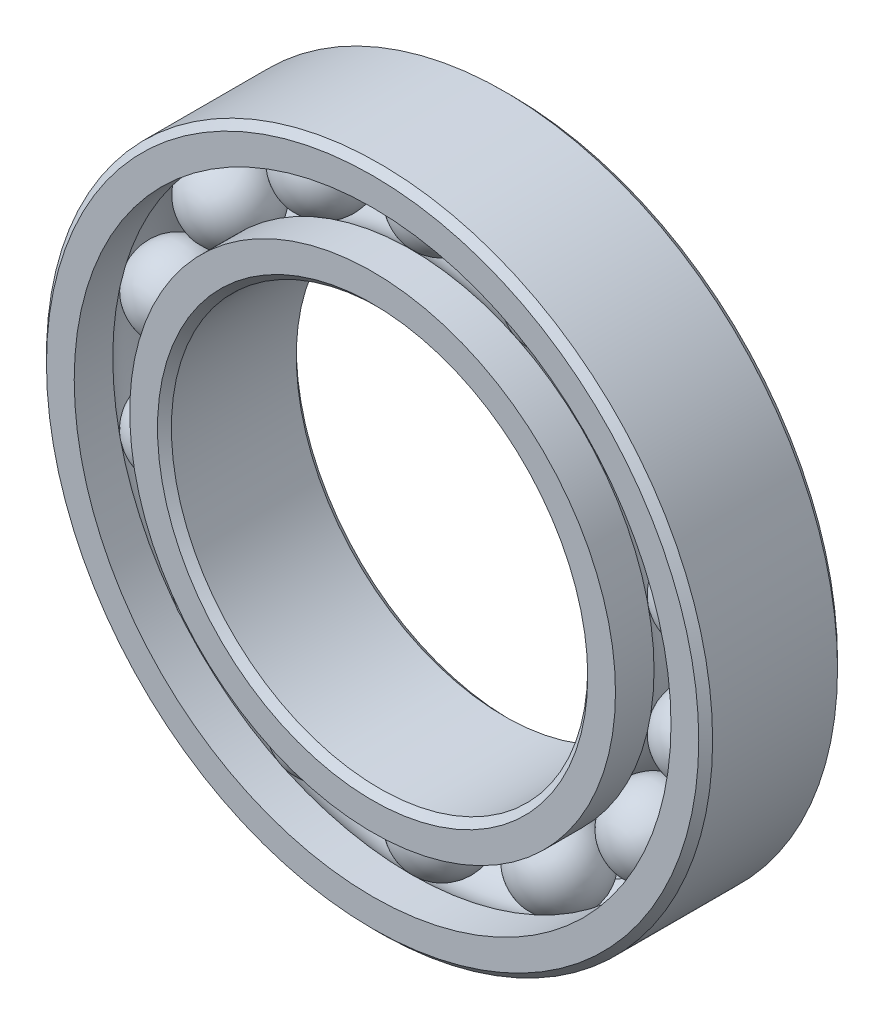
ISO-10303-21;
HEADER;
FILE_DESCRIPTION(('STEP AP214'),'2;1');
FILE_NAME('part.step','',(''),(''),'','','');
FILE_SCHEMA(('AUTOMOTIVE_DESIGN { 1 0 10303 214 1 1 1 1 }'));
ENDSEC;
DATA;
#1=APPLICATION_CONTEXT('core data for automotive mechanical design processes');
#2=APPLICATION_PROTOCOL_DEFINITION('international standard','automotive_design',2000,#1);
#3=PRODUCT_CONTEXT('',#1,'mechanical');
#4=PRODUCT('Part','Part','',(#3));
#5=PRODUCT_RELATED_PRODUCT_CATEGORY('part','',(#4));
#6=PRODUCT_DEFINITION_FORMATION('','',#4);
#7=PRODUCT_DEFINITION_CONTEXT('part definition',#1,'design');
#8=PRODUCT_DEFINITION('design','',#6,#7);
#9=PRODUCT_DEFINITION_SHAPE('','',#8);
#10=(LENGTH_UNIT() NAMED_UNIT(*) SI_UNIT(.MILLI.,.METRE.));
#11=(NAMED_UNIT(*) PLANE_ANGLE_UNIT() SI_UNIT($,.RADIAN.));
#12=(NAMED_UNIT(*) SI_UNIT($,.STERADIAN.) SOLID_ANGLE_UNIT());
#13=UNCERTAINTY_MEASURE_WITH_UNIT(LENGTH_MEASURE(1.E-05),#10,'distance_accuracy_value','');
#14=(GEOMETRIC_REPRESENTATION_CONTEXT(3) GLOBAL_UNCERTAINTY_ASSIGNED_CONTEXT((#13)) GLOBAL_UNIT_ASSIGNED_CONTEXT((#10,
#11,#12)) REPRESENTATION_CONTEXT('',''));
#15=CARTESIAN_POINT('',(0.,0.,0.));
#16=DIRECTION('',(0.,0.,1.));
#17=DIRECTION('',(1.,0.,0.));
#18=AXIS2_PLACEMENT_3D('',#15,#16,#17);
#19=CARTESIAN_POINT('',(4.23036645639608,8.78444646204864,0.));
#20=DIRECTION('',(0.,0.,1.));
#21=DIRECTION('',(0.433883739117546,0.900968867902425,0.));
#22=AXIS2_PLACEMENT_3D('',#19,#20,#21);
#23=SPHERICAL_SURFACE('',#22,1.49484711634152);
#24=CARTESIAN_POINT('',(4.23036645639608,8.78444646204864,1.49484711634152));
#25=VERTEX_POINT('',#24);
#26=VERTEX_LOOP('',#25);
#27=FACE_BOUND('',#26,.T.);
#28=ADVANCED_FACE('F41',(#27),#23,.T.);
#29=CLOSED_SHELL('',(#28));
#30=MANIFOLD_SOLID_BREP('B2',#29);
#31=CARTESIAN_POINT('',(7.62285695406322,6.07902556812275,0.));
#32=DIRECTION('',(0.,0.,1.));
#33=DIRECTION('',(0.781831482468022,0.623489801858743,0.));
#34=AXIS2_PLACEMENT_3D('',#31,#32,#33);
#35=SPHERICAL_SURFACE('',#34,1.49484711634152);
#36=CARTESIAN_POINT('',(7.62285695406322,6.07902556812275,1.49484711634152));
#37=VERTEX_POINT('',#36);
#38=VERTEX_LOOP('',#37);
#39=FACE_BOUND('',#38,.T.);
#40=ADVANCED_FACE('F63',(#39),#35,.T.);
#41=CLOSED_SHELL('',(#40));
#42=MANIFOLD_SOLID_BREP('B6',#41);
#43=CARTESIAN_POINT('',(9.50554714377276,2.16957910607417,0.));
#44=DIRECTION('',(0.,0.,1.));
#45=DIRECTION('',(0.974927912181821,0.222520933956325,0.));
#46=AXIS2_PLACEMENT_3D('',#43,#44,#45);
#47=SPHERICAL_SURFACE('',#46,1.49484711634152);
#48=CARTESIAN_POINT('',(9.50554714377276,2.16957910607417,1.49484711634152));
#49=VERTEX_POINT('',#48);
#50=VERTEX_LOOP('',#49);
#51=FACE_BOUND('',#50,.T.);
#52=ADVANCED_FACE('F85',(#51),#47,.T.);
#53=CLOSED_SHELL('',(#52));
#54=MANIFOLD_SOLID_BREP('B37',#53);
#55=CARTESIAN_POINT('',(9.5055471437728,-2.16957910607397,0.));
#56=DIRECTION('',(0.,0.,1.));
#57=DIRECTION('',(0.974927912181826,-0.222520933956305,0.));
#58=AXIS2_PLACEMENT_3D('',#55,#56,#57);
#59=SPHERICAL_SURFACE('',#58,1.49484711634152);
#60=CARTESIAN_POINT('',(9.5055471437728,-2.16957910607397,1.49484711634152));
#61=VERTEX_POINT('',#60);
#62=VERTEX_LOOP('',#61);
#63=FACE_BOUND('',#62,.T.);
#64=ADVANCED_FACE('F107',(#63),#59,.T.);
#65=CLOSED_SHELL('',(#64));
#66=MANIFOLD_SOLID_BREP('B59',#65);
#67=CARTESIAN_POINT('',(7.62285695406334,-6.07902556812259,0.));
#68=DIRECTION('',(0.,0.,1.));
#69=DIRECTION('',(0.781831482468035,-0.623489801858727,0.));
#70=AXIS2_PLACEMENT_3D('',#67,#68,#69);
#71=SPHERICAL_SURFACE('',#70,1.49484711634152);
#72=CARTESIAN_POINT('',(7.62285695406334,-6.07902556812259,1.49484711634152));
#73=VERTEX_POINT('',#72);
#74=VERTEX_LOOP('',#73);
#75=FACE_BOUND('',#74,.T.);
#76=ADVANCED_FACE('F129',(#75),#71,.T.);
#77=CLOSED_SHELL('',(#76));
#78=MANIFOLD_SOLID_BREP('B81',#77);
#79=CARTESIAN_POINT('',(4.23036645639626,-8.78444646204855,0.));
#80=DIRECTION('',(0.,0.,1.));
#81=DIRECTION('',(0.433883739117565,-0.900968867902416,0.));
#82=AXIS2_PLACEMENT_3D('',#79,#80,#81);
#83=SPHERICAL_SURFACE('',#82,1.49484711634152);
#84=CARTESIAN_POINT('',(4.23036645639626,-8.78444646204855,1.49484711634152));
#85=VERTEX_POINT('',#84);
#86=VERTEX_LOOP('',#85);
#87=FACE_BOUND('',#86,.T.);
#88=ADVANCED_FACE('F151',(#87),#83,.T.);
#89=CLOSED_SHELL('',(#88));
#90=MANIFOLD_SOLID_BREP('B103',#89);
#91=CARTESIAN_POINT('',(0.,-9.75,0.));
#92=DIRECTION('',(0.,0.,1.));
#93=DIRECTION('',(0.,-1.,0.));
#94=AXIS2_PLACEMENT_3D('',#91,#92,#93);
#95=SPHERICAL_SURFACE('',#94,1.49484711634152);
#96=CARTESIAN_POINT('',(0.,-9.75,1.49484711634152));
#97=VERTEX_POINT('',#96);
#98=VERTEX_LOOP('',#97);
#99=FACE_BOUND('',#98,.T.);
#100=ADVANCED_FACE('F173',(#99),#95,.T.);
#101=CLOSED_SHELL('',(#100));
#102=MANIFOLD_SOLID_BREP('B125',#101);
#103=CARTESIAN_POINT('',(-4.23036645639614,-8.78444646204861,0.));
#104=DIRECTION('',(0.,0.,1.));
#105=DIRECTION('',(-0.433883739117553,-0.900968867902422,0.));
#106=AXIS2_PLACEMENT_3D('',#103,#104,#105);
#107=SPHERICAL_SURFACE('',#106,1.49484711634152);
#108=CARTESIAN_POINT('',(-4.23036645639614,-8.78444646204861,1.49484711634152));
#109=VERTEX_POINT('',#108);
#110=VERTEX_LOOP('',#109);
#111=FACE_BOUND('',#110,.T.);
#112=ADVANCED_FACE('F195',(#111),#107,.T.);
#113=CLOSED_SHELL('',(#112));
#114=MANIFOLD_SOLID_BREP('B147',#113);
#115=CARTESIAN_POINT('',(-7.62285695406326,-6.07902556812269,0.));
#116=DIRECTION('',(0.,0.,1.));
#117=DIRECTION('',(-0.781831482468027,-0.623489801858737,0.));
#118=AXIS2_PLACEMENT_3D('',#115,#116,#117);
#119=SPHERICAL_SURFACE('',#118,1.49484711634152);
#120=CARTESIAN_POINT('',(-7.62285695406326,-6.07902556812269,1.49484711634152));
#121=VERTEX_POINT('',#120);
#122=VERTEX_LOOP('',#121);
#123=FACE_BOUND('',#122,.T.);
#124=ADVANCED_FACE('F217',(#123),#119,.T.);
#125=CLOSED_SHELL('',(#124));
#126=MANIFOLD_SOLID_BREP('B169',#125);
#127=CARTESIAN_POINT('',(-9.50554714377277,-2.1695791060741,0.));
#128=DIRECTION('',(0.,0.,1.));
#129=DIRECTION('',(-0.974927912181823,-0.222520933956318,0.));
#130=AXIS2_PLACEMENT_3D('',#127,#128,#129);
#131=SPHERICAL_SURFACE('',#130,1.49484711634152);
#132=CARTESIAN_POINT('',(-9.50554714377277,-2.1695791060741,1.49484711634152));
#133=VERTEX_POINT('',#132);
#134=VERTEX_LOOP('',#133);
#135=FACE_BOUND('',#134,.T.);
#136=ADVANCED_FACE('F239',(#135),#131,.T.);
#137=CLOSED_SHELL('',(#136));
#138=MANIFOLD_SOLID_BREP('B191',#137);
#139=CARTESIAN_POINT('',(-9.50554714377279,2.16957910607404,0.));
#140=DIRECTION('',(0.,0.,1.));
#141=DIRECTION('',(-0.974927912181824,0.222520933956311,0.));
#142=AXIS2_PLACEMENT_3D('',#139,#140,#141);
#143=SPHERICAL_SURFACE('',#142,1.49484711634152);
#144=CARTESIAN_POINT('',(-9.50554714377279,2.16957910607404,1.49484711634152));
#145=VERTEX_POINT('',#144);
#146=VERTEX_LOOP('',#145);
#147=FACE_BOUND('',#146,.T.);
#148=ADVANCED_FACE('F261',(#147),#143,.T.);
#149=CLOSED_SHELL('',(#148));
#150=MANIFOLD_SOLID_BREP('B213',#149);
#151=CARTESIAN_POINT('',(-7.6228569540633,6.07902556812264,0.));
#152=DIRECTION('',(0.,0.,1.));
#153=DIRECTION('',(-0.781831482468031,0.623489801858732,0.));
#154=AXIS2_PLACEMENT_3D('',#151,#152,#153);
#155=SPHERICAL_SURFACE('',#154,1.49484711634152);
#156=CARTESIAN_POINT('',(-7.6228569540633,6.07902556812264,1.49484711634152));
#157=VERTEX_POINT('',#156);
#158=VERTEX_LOOP('',#157);
#159=FACE_BOUND('',#158,.T.);
#160=ADVANCED_FACE('F283',(#159),#155,.T.);
#161=CLOSED_SHELL('',(#160));
#162=MANIFOLD_SOLID_BREP('B235',#161);
#163=CARTESIAN_POINT('',(-4.2303664563962,8.78444646204859,0.));
#164=DIRECTION('',(0.,0.,1.));
#165=DIRECTION('',(-0.433883739117559,0.900968867902419,0.));
#166=AXIS2_PLACEMENT_3D('',#163,#164,#165);
#167=SPHERICAL_SURFACE('',#166,1.49484711634152);
#168=CARTESIAN_POINT('',(-4.2303664563962,8.78444646204859,1.49484711634152));
#169=VERTEX_POINT('',#168);
#170=VERTEX_LOOP('',#169);
#171=FACE_BOUND('',#170,.T.);
#172=ADVANCED_FACE('F305',(#171),#167,.T.);
#173=CLOSED_SHELL('',(#172));
#174=MANIFOLD_SOLID_BREP('B257',#173);
#175=CARTESIAN_POINT('',(0.,9.75,0.));
#176=DIRECTION('',(0.,0.,1.));
#177=DIRECTION('',(0.,1.,0.));
#178=AXIS2_PLACEMENT_3D('',#175,#176,#177);
#179=SPHERICAL_SURFACE('',#178,1.49484711634152);
#180=CARTESIAN_POINT('',(0.,9.75,1.49484711634152));
#181=VERTEX_POINT('',#180);
#182=VERTEX_LOOP('',#181);
#183=FACE_BOUND('',#182,.T.);
#184=ADVANCED_FACE('F329',(#183),#179,.T.);
#185=CLOSED_SHELL('',(#184));
#186=MANIFOLD_SOLID_BREP('B279',#185);
#187=CARTESIAN_POINT('',(0.,8.75,2.5));
#188=DIRECTION('',(0.,0.,-1.));
#189=DIRECTION('',(-1.,0.,0.));
#190=AXIS2_PLACEMENT_3D('',#187,#188,#189);
#191=PLANE('',#190);
#192=CARTESIAN_POINT('',(0.,0.,2.5));
#193=DIRECTION('',(0.,0.,1.));
#194=DIRECTION('',(1.,0.,0.));
#195=AXIS2_PLACEMENT_3D('',#192,#193,#194);
#196=CIRCLE('',#195,7.75);
#197=CARTESIAN_POINT('',(7.75,0.,2.5));
#198=VERTEX_POINT('',#197);
#199=EDGE_CURVE('E378',#198,#198,#196,.T.);
#200=ORIENTED_EDGE('',*,*,#199,.F.);
#201=EDGE_LOOP('',(#200));
#202=FACE_BOUND('',#201,.T.);
#203=CARTESIAN_POINT('',(0.,0.,2.5));
#204=DIRECTION('',(0.,0.,1.));
#205=DIRECTION('',(1.,0.,0.));
#206=AXIS2_PLACEMENT_3D('',#203,#204,#205);
#207=CIRCLE('',#206,8.75);
#208=CARTESIAN_POINT('',(8.75,0.,2.5));
#209=VERTEX_POINT('',#208);
#210=EDGE_CURVE('E328',#209,#209,#207,.T.);
#211=ORIENTED_EDGE('',*,*,#210,.T.);
#212=EDGE_LOOP('',(#211));
#213=FACE_BOUND('',#212,.T.);
#214=ADVANCED_FACE('F350',(#202,#213),#191,.F.);
#215=CARTESIAN_POINT('',(0.,0.,2.5));
#216=DIRECTION('',(0.,0.,1.));
#217=DIRECTION('',(1.,0.,0.));
#218=AXIS2_PLACEMENT_3D('',#215,#216,#217);
#219=CYLINDRICAL_SURFACE('',#218,8.75);
#220=ORIENTED_EDGE('',*,*,#210,.F.);
#221=EDGE_LOOP('',(#220));
#222=FACE_BOUND('',#221,.T.);
#223=CARTESIAN_POINT('',(0.,0.,1.11111111111111));
#224=DIRECTION('',(0.,0.,1.));
#225=DIRECTION('',(1.,0.,0.));
#226=AXIS2_PLACEMENT_3D('',#223,#224,#225);
#227=CIRCLE('',#226,8.75);
#228=CARTESIAN_POINT('',(8.75,0.,1.11111111111111));
#229=VERTEX_POINT('',#228);
#230=EDGE_CURVE('E356',#229,#229,#227,.T.);
#231=ORIENTED_EDGE('',*,*,#230,.T.);
#232=EDGE_LOOP('',(#231));
#233=FACE_BOUND('',#232,.T.);
#234=ADVANCED_FACE('F385',(#222,#233),#219,.T.);
#235=CARTESIAN_POINT('',(0.,0.,0.));
#236=DIRECTION('',(0.,0.,1.));
#237=DIRECTION('',(1.,0.,0.));
#238=AXIS2_PLACEMENT_3D('',#235,#236,#237);
#239=TOROIDAL_SURFACE('',#238,9.75,1.49484711634152);
#240=ORIENTED_EDGE('',*,*,#230,.F.);
#241=EDGE_LOOP('',(#240));
#242=FACE_BOUND('',#241,.T.);
#243=CARTESIAN_POINT('',(0.,0.,-1.11111111111111));
#244=DIRECTION('',(0.,0.,1.));
#245=DIRECTION('',(1.,0.,0.));
#246=AXIS2_PLACEMENT_3D('',#243,#244,#245);
#247=CIRCLE('',#246,8.75);
#248=CARTESIAN_POINT('',(8.75,0.,-1.11111111111111));
#249=VERTEX_POINT('',#248);
#250=EDGE_CURVE('E360',#249,#249,#247,.T.);
#251=ORIENTED_EDGE('',*,*,#250,.T.);
#252=EDGE_LOOP('',(#251));
#253=FACE_BOUND('',#252,.T.);
#254=ADVANCED_FACE('F389',(#242,#253),#239,.F.);
#255=CARTESIAN_POINT('',(0.,0.,2.5));
#256=DIRECTION('',(0.,0.,1.));
#257=DIRECTION('',(1.,0.,0.));
#258=AXIS2_PLACEMENT_3D('',#255,#256,#257);
#259=CYLINDRICAL_SURFACE('',#258,8.75);
#260=ORIENTED_EDGE('',*,*,#250,.F.);
#261=EDGE_LOOP('',(#260));
#262=FACE_BOUND('',#261,.T.);
#263=CARTESIAN_POINT('',(0.,0.,-2.5));
#264=DIRECTION('',(0.,0.,1.));
#265=DIRECTION('',(1.,0.,0.));
#266=AXIS2_PLACEMENT_3D('',#263,#264,#265);
#267=CIRCLE('',#266,8.75);
#268=CARTESIAN_POINT('',(8.75,0.,-2.5));
#269=VERTEX_POINT('',#268);
#270=EDGE_CURVE('E364',#269,#269,#267,.T.);
#271=ORIENTED_EDGE('',*,*,#270,.T.);
#272=EDGE_LOOP('',(#271));
#273=FACE_BOUND('',#272,.T.);
#274=ADVANCED_FACE('F394',(#262,#273),#259,.T.);
#275=CARTESIAN_POINT('',(0.,7.75,-2.5));
#276=DIRECTION('',(0.,0.,1.));
#277=DIRECTION('',(1.,0.,0.));
#278=AXIS2_PLACEMENT_3D('',#275,#276,#277);
#279=PLANE('',#278);
#280=ORIENTED_EDGE('',*,*,#270,.F.);
#281=EDGE_LOOP('',(#280));
#282=FACE_BOUND('',#281,.T.);
#283=CARTESIAN_POINT('',(0.,0.,-2.5));
#284=DIRECTION('',(0.,0.,1.));
#285=DIRECTION('',(1.,0.,0.));
#286=AXIS2_PLACEMENT_3D('',#283,#284,#285);
#287=CIRCLE('',#286,7.75);
#288=CARTESIAN_POINT('',(7.75,0.,-2.5));
#289=VERTEX_POINT('',#288);
#290=EDGE_CURVE('E369',#289,#289,#287,.T.);
#291=ORIENTED_EDGE('',*,*,#290,.T.);
#292=EDGE_LOOP('',(#291));
#293=FACE_BOUND('',#292,.T.);
#294=ADVANCED_FACE('F400',(#282,#293),#279,.F.);
#295=CARTESIAN_POINT('',(0.,0.,-2.25));
#296=DIRECTION('',(0.,0.,-1.));
#297=DIRECTION('',(-1.,0.,0.));
#298=AXIS2_PLACEMENT_3D('',#295,#296,#297);
#299=CONICAL_SURFACE('',#298,7.5,0.785398163397448);
#300=ORIENTED_EDGE('',*,*,#290,.F.);
#301=EDGE_LOOP('',(#300));
#302=FACE_BOUND('',#301,.T.);
#303=CARTESIAN_POINT('',(0.,0.,-2.25));
#304=DIRECTION('',(0.,0.,1.));
#305=DIRECTION('',(1.,0.,0.));
#306=AXIS2_PLACEMENT_3D('',#303,#304,#305);
#307=CIRCLE('',#306,7.5);
#308=CARTESIAN_POINT('',(7.5,0.,-2.25));
#309=VERTEX_POINT('',#308);
#310=EDGE_CURVE('E372',#309,#309,#307,.T.);
#311=ORIENTED_EDGE('',*,*,#310,.T.);
#312=EDGE_LOOP('',(#311));
#313=FACE_BOUND('',#312,.T.);
#314=ADVANCED_FACE('F404',(#302,#313),#299,.F.);
#315=CARTESIAN_POINT('',(0.,0.,2.5));
#316=DIRECTION('',(0.,0.,1.));
#317=DIRECTION('',(1.,0.,0.));
#318=AXIS2_PLACEMENT_3D('',#315,#316,#317);
#319=CYLINDRICAL_SURFACE('',#318,7.5);
#320=ORIENTED_EDGE('',*,*,#310,.F.);
#321=EDGE_LOOP('',(#320));
#322=FACE_BOUND('',#321,.T.);
#323=CARTESIAN_POINT('',(0.,0.,2.25));
#324=DIRECTION('',(0.,0.,1.));
#325=DIRECTION('',(1.,0.,0.));
#326=AXIS2_PLACEMENT_3D('',#323,#324,#325);
#327=CIRCLE('',#326,7.5);
#328=CARTESIAN_POINT('',(7.5,0.,2.25));
#329=VERTEX_POINT('',#328);
#330=EDGE_CURVE('E375',#329,#329,#327,.T.);
#331=ORIENTED_EDGE('',*,*,#330,.T.);
#332=EDGE_LOOP('',(#331));
#333=FACE_BOUND('',#332,.T.);
#334=ADVANCED_FACE('F408',(#322,#333),#319,.F.);
#335=CARTESIAN_POINT('',(0.,0.,2.5));
#336=DIRECTION('',(0.,0.,1.));
#337=DIRECTION('',(1.,0.,0.));
#338=AXIS2_PLACEMENT_3D('',#335,#336,#337);
#339=CONICAL_SURFACE('',#338,7.75,0.785398163397447);
#340=ORIENTED_EDGE('',*,*,#330,.F.);
#341=EDGE_LOOP('',(#340));
#342=FACE_BOUND('',#341,.T.);
#343=ORIENTED_EDGE('',*,*,#199,.T.);
#344=EDGE_LOOP('',(#343));
#345=FACE_BOUND('',#344,.T.);
#346=ADVANCED_FACE('F382',(#342,#345),#339,.F.);
#347=CLOSED_SHELL('',(#214,#234,#254,#274,#294,#314,#334,#346));
#348=MANIFOLD_SOLID_BREP('B301',#347);
#349=CARTESIAN_POINT('',(0.,0.,2.25));
#350=DIRECTION('',(0.,0.,-1.));
#351=DIRECTION('',(-1.,0.,0.));
#352=AXIS2_PLACEMENT_3D('',#349,#350,#351);
#353=CONICAL_SURFACE('',#352,12.,0.785398163397447);
#354=CARTESIAN_POINT('',(0.,0.,2.5));
#355=DIRECTION('',(0.,0.,1.));
#356=DIRECTION('',(1.,0.,0.));
#357=AXIS2_PLACEMENT_3D('',#354,#355,#356);
#358=CIRCLE('',#357,11.75);
#359=CARTESIAN_POINT('',(11.75,0.,2.5));
#360=VERTEX_POINT('',#359);
#361=EDGE_CURVE('E515',#360,#360,#358,.T.);
#362=ORIENTED_EDGE('',*,*,#361,.F.);
#363=EDGE_LOOP('',(#362));
#364=FACE_BOUND('',#363,.T.);
#365=CARTESIAN_POINT('',(0.,0.,2.25));
#366=DIRECTION('',(0.,0.,1.));
#367=DIRECTION('',(1.,0.,0.));
#368=AXIS2_PLACEMENT_3D('',#365,#366,#367);
#369=CIRCLE('',#368,12.);
#370=CARTESIAN_POINT('',(12.,0.,2.25));
#371=VERTEX_POINT('',#370);
#372=EDGE_CURVE('E349',#371,#371,#369,.T.);
#373=ORIENTED_EDGE('',*,*,#372,.T.);
#374=EDGE_LOOP('',(#373));
#375=FACE_BOUND('',#374,.T.);
#376=ADVANCED_FACE('F487',(#364,#375),#353,.T.);
#377=CARTESIAN_POINT('',(0.,0.,2.5));
#378=DIRECTION('',(0.,0.,1.));
#379=DIRECTION('',(1.,0.,0.));
#380=AXIS2_PLACEMENT_3D('',#377,#378,#379);
#381=CYLINDRICAL_SURFACE('',#380,12.);
#382=ORIENTED_EDGE('',*,*,#372,.F.);
#383=EDGE_LOOP('',(#382));
#384=FACE_BOUND('',#383,.T.);
#385=CARTESIAN_POINT('',(0.,0.,-2.25));
#386=DIRECTION('',(0.,0.,1.));
#387=DIRECTION('',(1.,0.,0.));
#388=AXIS2_PLACEMENT_3D('',#385,#386,#387);
#389=CIRCLE('',#388,12.);
#390=CARTESIAN_POINT('',(12.,0.,-2.25));
#391=VERTEX_POINT('',#390);
#392=EDGE_CURVE('E493',#391,#391,#389,.T.);
#393=ORIENTED_EDGE('',*,*,#392,.T.);
#394=EDGE_LOOP('',(#393));
#395=FACE_BOUND('',#394,.T.);
#396=ADVANCED_FACE('F522',(#384,#395),#381,.T.);
#397=CARTESIAN_POINT('',(0.,0.,-2.5));
#398=DIRECTION('',(0.,0.,1.));
#399=DIRECTION('',(1.,0.,0.));
#400=AXIS2_PLACEMENT_3D('',#397,#398,#399);
#401=CONICAL_SURFACE('',#400,11.75,0.785398163397448);
#402=ORIENTED_EDGE('',*,*,#392,.F.);
#403=EDGE_LOOP('',(#402));
#404=FACE_BOUND('',#403,.T.);
#405=CARTESIAN_POINT('',(0.,0.,-2.5));
#406=DIRECTION('',(0.,0.,1.));
#407=DIRECTION('',(1.,0.,0.));
#408=AXIS2_PLACEMENT_3D('',#405,#406,#407);
#409=CIRCLE('',#408,11.75);
#410=CARTESIAN_POINT('',(11.75,0.,-2.5));
#411=VERTEX_POINT('',#410);
#412=EDGE_CURVE('E497',#411,#411,#409,.T.);
#413=ORIENTED_EDGE('',*,*,#412,.T.);
#414=EDGE_LOOP('',(#413));
#415=FACE_BOUND('',#414,.T.);
#416=ADVANCED_FACE('F526',(#404,#415),#401,.T.);
#417=CARTESIAN_POINT('',(0.,11.75,-2.5));
#418=DIRECTION('',(0.,0.,1.));
#419=DIRECTION('',(1.,0.,0.));
#420=AXIS2_PLACEMENT_3D('',#417,#418,#419);
#421=PLANE('',#420);
#422=ORIENTED_EDGE('',*,*,#412,.F.);
#423=EDGE_LOOP('',(#422));
#424=FACE_BOUND('',#423,.T.);
#425=CARTESIAN_POINT('',(0.,0.,-2.5));
#426=DIRECTION('',(0.,0.,1.));
#427=DIRECTION('',(1.,0.,0.));
#428=AXIS2_PLACEMENT_3D('',#425,#426,#427);
#429=CIRCLE('',#428,10.75);
#430=CARTESIAN_POINT('',(10.75,0.,-2.5));
#431=VERTEX_POINT('',#430);
#432=EDGE_CURVE('E501',#431,#431,#429,.T.);
#433=ORIENTED_EDGE('',*,*,#432,.T.);
#434=EDGE_LOOP('',(#433));
#435=FACE_BOUND('',#434,.T.);
#436=ADVANCED_FACE('F531',(#424,#435),#421,.F.);
#437=CARTESIAN_POINT('',(0.,0.,2.5));
#438=DIRECTION('',(0.,0.,1.));
#439=DIRECTION('',(1.,0.,0.));
#440=AXIS2_PLACEMENT_3D('',#437,#438,#439);
#441=CYLINDRICAL_SURFACE('',#440,10.75);
#442=ORIENTED_EDGE('',*,*,#432,.F.);
#443=EDGE_LOOP('',(#442));
#444=FACE_BOUND('',#443,.T.);
#445=CARTESIAN_POINT('',(0.,0.,-1.11111111111111));
#446=DIRECTION('',(0.,0.,1.));
#447=DIRECTION('',(1.,0.,0.));
#448=AXIS2_PLACEMENT_3D('',#445,#446,#447);
#449=CIRCLE('',#448,10.75);
#450=CARTESIAN_POINT('',(10.75,0.,-1.11111111111111));
#451=VERTEX_POINT('',#450);
#452=EDGE_CURVE('E506',#451,#451,#449,.T.);
#453=ORIENTED_EDGE('',*,*,#452,.T.);
#454=EDGE_LOOP('',(#453));
#455=FACE_BOUND('',#454,.T.);
#456=ADVANCED_FACE('F537',(#444,#455),#441,.F.);
#457=CARTESIAN_POINT('',(0.,0.,0.));
#458=DIRECTION('',(0.,0.,1.));
#459=DIRECTION('',(1.,0.,0.));
#460=AXIS2_PLACEMENT_3D('',#457,#458,#459);
#461=TOROIDAL_SURFACE('',#460,9.75,1.49484711634152);
#462=ORIENTED_EDGE('',*,*,#452,.F.);
#463=EDGE_LOOP('',(#462));
#464=FACE_BOUND('',#463,.T.);
#465=CARTESIAN_POINT('',(0.,0.,1.11111111111111));
#466=DIRECTION('',(0.,0.,1.));
#467=DIRECTION('',(1.,0.,0.));
#468=AXIS2_PLACEMENT_3D('',#465,#466,#467);
#469=CIRCLE('',#468,10.75);
#470=CARTESIAN_POINT('',(10.75,0.,1.11111111111111));
#471=VERTEX_POINT('',#470);
#472=EDGE_CURVE('E509',#471,#471,#469,.T.);
#473=ORIENTED_EDGE('',*,*,#472,.T.);
#474=EDGE_LOOP('',(#473));
#475=FACE_BOUND('',#474,.T.);
#476=ADVANCED_FACE('F541',(#464,#475),#461,.F.);
#477=CARTESIAN_POINT('',(0.,0.,2.5));
#478=DIRECTION('',(0.,0.,1.));
#479=DIRECTION('',(1.,0.,0.));
#480=AXIS2_PLACEMENT_3D('',#477,#478,#479);
#481=CYLINDRICAL_SURFACE('',#480,10.75);
#482=ORIENTED_EDGE('',*,*,#472,.F.);
#483=EDGE_LOOP('',(#482));
#484=FACE_BOUND('',#483,.T.);
#485=CARTESIAN_POINT('',(0.,0.,2.5));
#486=DIRECTION('',(0.,0.,1.));
#487=DIRECTION('',(1.,0.,0.));
#488=AXIS2_PLACEMENT_3D('',#485,#486,#487);
#489=CIRCLE('',#488,10.75);
#490=CARTESIAN_POINT('',(10.75,0.,2.5));
#491=VERTEX_POINT('',#490);
#492=EDGE_CURVE('E512',#491,#491,#489,.T.);
#493=ORIENTED_EDGE('',*,*,#492,.T.);
#494=EDGE_LOOP('',(#493));
#495=FACE_BOUND('',#494,.T.);
#496=ADVANCED_FACE('F545',(#484,#495),#481,.F.);
#497=CARTESIAN_POINT('',(0.,11.75,2.5));
#498=DIRECTION('',(0.,0.,-1.));
#499=DIRECTION('',(-1.,0.,0.));
#500=AXIS2_PLACEMENT_3D('',#497,#498,#499);
#501=PLANE('',#500);
#502=ORIENTED_EDGE('',*,*,#492,.F.);
#503=EDGE_LOOP('',(#502));
#504=FACE_BOUND('',#503,.T.);
#505=ORIENTED_EDGE('',*,*,#361,.T.);
#506=EDGE_LOOP('',(#505));
#507=FACE_BOUND('',#506,.T.);
#508=ADVANCED_FACE('F519',(#504,#507),#501,.F.);
#509=CLOSED_SHELL('',(#376,#396,#416,#436,#456,#476,#496,#508));
#510=MANIFOLD_SOLID_BREP('B323',#509);
#511=ADVANCED_BREP_SHAPE_REPRESENTATION('',(#18,#30,#42,#54,#66,#78,#90,#102,#114,#126,#138,
#150,#162,#174,#186,#348,#510),#14);
#512=SHAPE_DEFINITION_REPRESENTATION(#9,#511);
ENDSEC;
END-ISO-10303-21;
